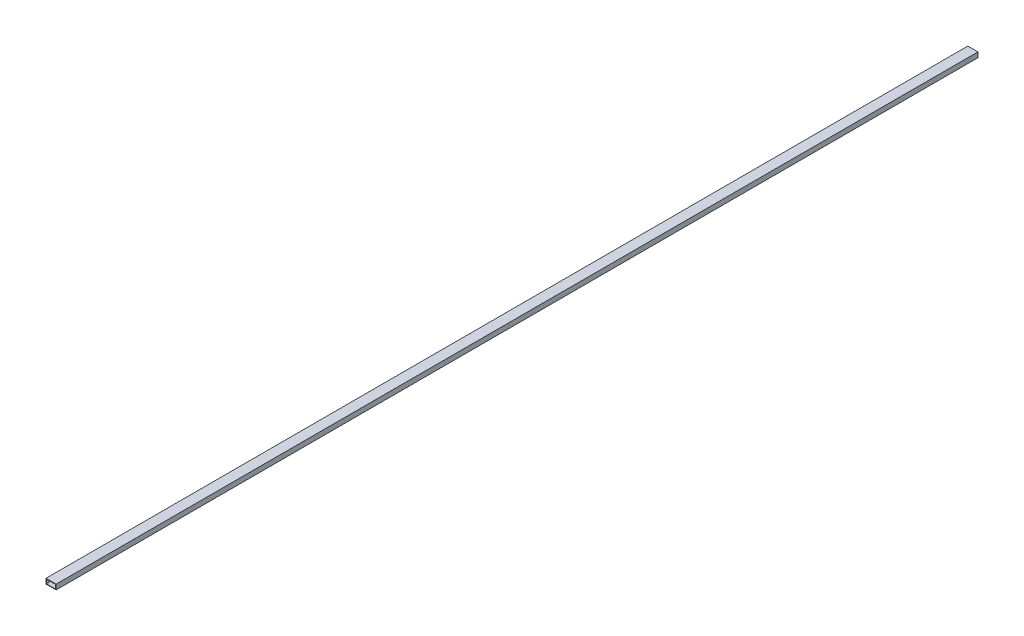
ISO-10303-21;
HEADER;
FILE_DESCRIPTION(('STEP AP214'),'2;1');
FILE_NAME('part.step','',(''),(''),'','','');
FILE_SCHEMA(('AUTOMOTIVE_DESIGN { 1 0 10303 214 1 1 1 1 }'));
ENDSEC;
DATA;
#1=APPLICATION_CONTEXT('core data for automotive mechanical design processes');
#2=APPLICATION_PROTOCOL_DEFINITION('international standard','automotive_design',2000,#1);
#3=PRODUCT_CONTEXT('',#1,'mechanical');
#4=PRODUCT('Part','Part','',(#3));
#5=PRODUCT_RELATED_PRODUCT_CATEGORY('part','',(#4));
#6=PRODUCT_DEFINITION_FORMATION('','',#4);
#7=PRODUCT_DEFINITION_CONTEXT('part definition',#1,'design');
#8=PRODUCT_DEFINITION('design','',#6,#7);
#9=PRODUCT_DEFINITION_SHAPE('','',#8);
#10=(LENGTH_UNIT() NAMED_UNIT(*) SI_UNIT(.MILLI.,.METRE.));
#11=(NAMED_UNIT(*) PLANE_ANGLE_UNIT() SI_UNIT($,.RADIAN.));
#12=(NAMED_UNIT(*) SI_UNIT($,.STERADIAN.) SOLID_ANGLE_UNIT());
#13=UNCERTAINTY_MEASURE_WITH_UNIT(LENGTH_MEASURE(1.E-05),#10,'distance_accuracy_value','');
#14=(GEOMETRIC_REPRESENTATION_CONTEXT(3) GLOBAL_UNCERTAINTY_ASSIGNED_CONTEXT((#13)) GLOBAL_UNIT_ASSIGNED_CONTEXT((#10,
#11,#12)) REPRESENTATION_CONTEXT('',''));
#15=CARTESIAN_POINT('',(0.,0.,0.));
#16=DIRECTION('',(0.,0.,1.));
#17=DIRECTION('',(1.,0.,0.));
#18=AXIS2_PLACEMENT_3D('',#15,#16,#17);
#19=CARTESIAN_POINT('',(0.,0.,1820.));
#20=DIRECTION('',(0.,0.,-1.));
#21=DIRECTION('',(-1.,0.,0.));
#22=AXIS2_PLACEMENT_3D('',#19,#20,#21);
#23=PLANE('',#22);
#24=DIRECTION('',(0.,-1.,0.));
#25=VECTOR('',#24,1.);
#26=CARTESIAN_POINT('',(0.,0.,1820.));
#27=LINE('',#26,#25);
#28=CARTESIAN_POINT('',(0.,10.,1820.));
#29=VERTEX_POINT('',#28);
#30=CARTESIAN_POINT('',(0.,0.,1820.));
#31=VERTEX_POINT('',#30);
#32=EDGE_CURVE('E136',#29,#31,#27,.T.);
#33=ORIENTED_EDGE('',*,*,#32,.T.);
#34=DIRECTION('',(1.,0.,0.));
#35=VECTOR('',#34,1.);
#36=CARTESIAN_POINT('',(0.,0.,1820.));
#37=LINE('',#36,#35);
#38=CARTESIAN_POINT('',(20.,0.,1820.));
#39=VERTEX_POINT('',#38);
#40=EDGE_CURVE('E139',#31,#39,#37,.T.);
#41=ORIENTED_EDGE('',*,*,#40,.T.);
#42=DIRECTION('',(0.,1.,0.));
#43=VECTOR('',#42,1.);
#44=CARTESIAN_POINT('',(20.,0.,1820.));
#45=LINE('',#44,#43);
#46=CARTESIAN_POINT('',(20.,10.,1820.));
#47=VERTEX_POINT('',#46);
#48=EDGE_CURVE('E142',#39,#47,#45,.T.);
#49=ORIENTED_EDGE('',*,*,#48,.T.);
#50=DIRECTION('',(-1.,0.,0.));
#51=VECTOR('',#50,1.);
#52=CARTESIAN_POINT('',(0.,10.,1820.));
#53=LINE('',#52,#51);
#54=EDGE_CURVE('E144',#47,#29,#53,.T.);
#55=ORIENTED_EDGE('',*,*,#54,.T.);
#56=EDGE_LOOP('',(#33,#41,#49,#55));
#57=FACE_BOUND('',#56,.T.);
#58=DIRECTION('',(0.,-1.,0.));
#59=VECTOR('',#58,1.);
#60=CARTESIAN_POINT('',(1.,1.,1820.));
#61=LINE('',#60,#59);
#62=CARTESIAN_POINT('',(1.,9.,1820.));
#63=VERTEX_POINT('',#62);
#64=CARTESIAN_POINT('',(1.,1.,1820.));
#65=VERTEX_POINT('',#64);
#66=EDGE_CURVE('E100',#63,#65,#61,.T.);
#67=ORIENTED_EDGE('',*,*,#66,.F.);
#68=DIRECTION('',(-1.,0.,0.));
#69=VECTOR('',#68,1.);
#70=CARTESIAN_POINT('',(1.,9.,1820.));
#71=LINE('',#70,#69);
#72=CARTESIAN_POINT('',(19.,9.,1820.));
#73=VERTEX_POINT('',#72);
#74=EDGE_CURVE('E122',#73,#63,#71,.T.);
#75=ORIENTED_EDGE('',*,*,#74,.F.);
#76=DIRECTION('',(0.,1.,0.));
#77=VECTOR('',#76,1.);
#78=CARTESIAN_POINT('',(19.,1.,1820.));
#79=LINE('',#78,#77);
#80=CARTESIAN_POINT('',(19.,1.,1820.));
#81=VERTEX_POINT('',#80);
#82=EDGE_CURVE('E120',#81,#73,#79,.T.);
#83=ORIENTED_EDGE('',*,*,#82,.F.);
#84=DIRECTION('',(1.,0.,0.));
#85=VECTOR('',#84,1.);
#86=CARTESIAN_POINT('',(1.,1.,1820.));
#87=LINE('',#86,#85);
#88=EDGE_CURVE('E108',#65,#81,#87,.T.);
#89=ORIENTED_EDGE('',*,*,#88,.F.);
#90=EDGE_LOOP('',(#67,#75,#83,#89));
#91=FACE_BOUND('',#90,.T.);
#92=ADVANCED_FACE('F35',(#57,#91),#23,.F.);
#93=CARTESIAN_POINT('',(0.,0.,0.));
#94=DIRECTION('',(0.,0.,-1.));
#95=DIRECTION('',(-1.,0.,0.));
#96=AXIS2_PLACEMENT_3D('',#93,#94,#95);
#97=PLANE('',#96);
#98=DIRECTION('',(0.,-1.,0.));
#99=VECTOR('',#98,1.);
#100=CARTESIAN_POINT('',(0.,0.,0.));
#101=LINE('',#100,#99);
#102=CARTESIAN_POINT('',(0.,10.,0.));
#103=VERTEX_POINT('',#102);
#104=CARTESIAN_POINT('',(0.,0.,0.));
#105=VERTEX_POINT('',#104);
#106=EDGE_CURVE('E116',#103,#105,#101,.T.);
#107=ORIENTED_EDGE('',*,*,#106,.F.);
#108=DIRECTION('',(-1.,0.,0.));
#109=VECTOR('',#108,1.);
#110=CARTESIAN_POINT('',(0.,10.,0.));
#111=LINE('',#110,#109);
#112=CARTESIAN_POINT('',(20.,10.,0.));
#113=VERTEX_POINT('',#112);
#114=EDGE_CURVE('E140',#113,#103,#111,.T.);
#115=ORIENTED_EDGE('',*,*,#114,.F.);
#116=DIRECTION('',(0.,1.,0.));
#117=VECTOR('',#116,1.);
#118=CARTESIAN_POINT('',(20.,0.,0.));
#119=LINE('',#118,#117);
#120=CARTESIAN_POINT('',(20.,0.,0.));
#121=VERTEX_POINT('',#120);
#122=EDGE_CURVE('E151',#121,#113,#119,.T.);
#123=ORIENTED_EDGE('',*,*,#122,.F.);
#124=DIRECTION('',(1.,0.,0.));
#125=VECTOR('',#124,1.);
#126=CARTESIAN_POINT('',(0.,0.,0.));
#127=LINE('',#126,#125);
#128=EDGE_CURVE('E149',#105,#121,#127,.T.);
#129=ORIENTED_EDGE('',*,*,#128,.F.);
#130=EDGE_LOOP('',(#107,#115,#123,#129));
#131=FACE_BOUND('',#130,.T.);
#132=DIRECTION('',(-1.,0.,0.));
#133=VECTOR('',#132,1.);
#134=CARTESIAN_POINT('',(1.,9.,0.));
#135=LINE('',#134,#133);
#136=CARTESIAN_POINT('',(19.,9.,0.));
#137=VERTEX_POINT('',#136);
#138=CARTESIAN_POINT('',(1.,9.,0.));
#139=VERTEX_POINT('',#138);
#140=EDGE_CURVE('E109',#137,#139,#135,.T.);
#141=ORIENTED_EDGE('',*,*,#140,.T.);
#142=DIRECTION('',(0.,-1.,0.));
#143=VECTOR('',#142,1.);
#144=CARTESIAN_POINT('',(1.,1.,0.));
#145=LINE('',#144,#143);
#146=CARTESIAN_POINT('',(1.,1.,0.));
#147=VERTEX_POINT('',#146);
#148=EDGE_CURVE('E58',#139,#147,#145,.T.);
#149=ORIENTED_EDGE('',*,*,#148,.T.);
#150=DIRECTION('',(1.,0.,0.));
#151=VECTOR('',#150,1.);
#152=CARTESIAN_POINT('',(1.,1.,0.));
#153=LINE('',#152,#151);
#154=CARTESIAN_POINT('',(19.,1.,0.));
#155=VERTEX_POINT('',#154);
#156=EDGE_CURVE('E115',#147,#155,#153,.T.);
#157=ORIENTED_EDGE('',*,*,#156,.T.);
#158=DIRECTION('',(0.,1.,0.));
#159=VECTOR('',#158,1.);
#160=CARTESIAN_POINT('',(19.,1.,0.));
#161=LINE('',#160,#159);
#162=EDGE_CURVE('E128',#155,#137,#161,.T.);
#163=ORIENTED_EDGE('',*,*,#162,.T.);
#164=EDGE_LOOP('',(#141,#149,#157,#163));
#165=FACE_BOUND('',#164,.T.);
#166=ADVANCED_FACE('F169',(#131,#165),#97,.T.);
#167=CARTESIAN_POINT('',(0.,0.,1820.));
#168=DIRECTION('',(1.,0.,0.));
#169=DIRECTION('',(0.,0.,-1.));
#170=AXIS2_PLACEMENT_3D('',#167,#168,#169);
#171=PLANE('',#170);
#172=ORIENTED_EDGE('',*,*,#106,.T.);
#173=DIRECTION('',(0.,0.,-1.));
#174=VECTOR('',#173,1.);
#175=CARTESIAN_POINT('',(0.,0.,1820.));
#176=LINE('',#175,#174);
#177=EDGE_CURVE('E11',#31,#105,#176,.T.);
#178=ORIENTED_EDGE('',*,*,#177,.F.);
#179=ORIENTED_EDGE('',*,*,#32,.F.);
#180=DIRECTION('',(0.,0.,-1.));
#181=VECTOR('',#180,1.);
#182=CARTESIAN_POINT('',(0.,10.,1820.));
#183=LINE('',#182,#181);
#184=EDGE_CURVE('E146',#29,#103,#183,.T.);
#185=ORIENTED_EDGE('',*,*,#184,.T.);
#186=EDGE_LOOP('',(#172,#178,#179,#185));
#187=FACE_BOUND('',#186,.T.);
#188=ADVANCED_FACE('F37',(#187),#171,.F.);
#189=CARTESIAN_POINT('',(0.,0.,1820.));
#190=DIRECTION('',(0.,1.,0.));
#191=DIRECTION('',(0.,0.,1.));
#192=AXIS2_PLACEMENT_3D('',#189,#190,#191);
#193=PLANE('',#192);
#194=ORIENTED_EDGE('',*,*,#128,.T.);
#195=DIRECTION('',(0.,0.,-1.));
#196=VECTOR('',#195,1.);
#197=CARTESIAN_POINT('',(20.,0.,1820.));
#198=LINE('',#197,#196);
#199=EDGE_CURVE('E43',#39,#121,#198,.T.);
#200=ORIENTED_EDGE('',*,*,#199,.F.);
#201=ORIENTED_EDGE('',*,*,#40,.F.);
#202=ORIENTED_EDGE('',*,*,#177,.T.);
#203=EDGE_LOOP('',(#194,#200,#201,#202));
#204=FACE_BOUND('',#203,.T.);
#205=ADVANCED_FACE('F179',(#204),#193,.F.);
#206=CARTESIAN_POINT('',(20.,0.,1820.));
#207=DIRECTION('',(-1.,0.,0.));
#208=DIRECTION('',(0.,0.,1.));
#209=AXIS2_PLACEMENT_3D('',#206,#207,#208);
#210=PLANE('',#209);
#211=ORIENTED_EDGE('',*,*,#122,.T.);
#212=DIRECTION('',(0.,0.,-1.));
#213=VECTOR('',#212,1.);
#214=CARTESIAN_POINT('',(20.,10.,1820.));
#215=LINE('',#214,#213);
#216=EDGE_CURVE('E156',#47,#113,#215,.T.);
#217=ORIENTED_EDGE('',*,*,#216,.F.);
#218=ORIENTED_EDGE('',*,*,#48,.F.);
#219=ORIENTED_EDGE('',*,*,#199,.T.);
#220=EDGE_LOOP('',(#211,#217,#218,#219));
#221=FACE_BOUND('',#220,.T.);
#222=ADVANCED_FACE('F163',(#221),#210,.F.);
#223=CARTESIAN_POINT('',(0.,10.,1820.));
#224=DIRECTION('',(0.,-1.,0.));
#225=DIRECTION('',(0.,0.,-1.));
#226=AXIS2_PLACEMENT_3D('',#223,#224,#225);
#227=PLANE('',#226);
#228=ORIENTED_EDGE('',*,*,#114,.T.);
#229=ORIENTED_EDGE('',*,*,#184,.F.);
#230=ORIENTED_EDGE('',*,*,#54,.F.);
#231=ORIENTED_EDGE('',*,*,#216,.T.);
#232=EDGE_LOOP('',(#228,#229,#230,#231));
#233=FACE_BOUND('',#232,.T.);
#234=ADVANCED_FACE('F173',(#233),#227,.F.);
#235=CARTESIAN_POINT('',(1.,1.,1820.));
#236=DIRECTION('',(1.,0.,0.));
#237=DIRECTION('',(0.,0.,-1.));
#238=AXIS2_PLACEMENT_3D('',#235,#236,#237);
#239=PLANE('',#238);
#240=ORIENTED_EDGE('',*,*,#148,.F.);
#241=DIRECTION('',(0.,0.,-1.));
#242=VECTOR('',#241,1.);
#243=CARTESIAN_POINT('',(1.,9.,1820.));
#244=LINE('',#243,#242);
#245=EDGE_CURVE('E104',#63,#139,#244,.T.);
#246=ORIENTED_EDGE('',*,*,#245,.F.);
#247=ORIENTED_EDGE('',*,*,#66,.T.);
#248=DIRECTION('',(0.,0.,-1.));
#249=VECTOR('',#248,1.);
#250=CARTESIAN_POINT('',(1.,1.,1820.));
#251=LINE('',#250,#249);
#252=EDGE_CURVE('E103',#65,#147,#251,.T.);
#253=ORIENTED_EDGE('',*,*,#252,.T.);
#254=EDGE_LOOP('',(#240,#246,#247,#253));
#255=FACE_BOUND('',#254,.T.);
#256=ADVANCED_FACE('F102',(#255),#239,.T.);
#257=CARTESIAN_POINT('',(1.,1.,1820.));
#258=DIRECTION('',(0.,1.,0.));
#259=DIRECTION('',(0.,0.,1.));
#260=AXIS2_PLACEMENT_3D('',#257,#258,#259);
#261=PLANE('',#260);
#262=ORIENTED_EDGE('',*,*,#156,.F.);
#263=ORIENTED_EDGE('',*,*,#252,.F.);
#264=ORIENTED_EDGE('',*,*,#88,.T.);
#265=DIRECTION('',(0.,0.,-1.));
#266=VECTOR('',#265,1.);
#267=CARTESIAN_POINT('',(19.,1.,1820.));
#268=LINE('',#267,#266);
#269=EDGE_CURVE('E117',#81,#155,#268,.T.);
#270=ORIENTED_EDGE('',*,*,#269,.T.);
#271=EDGE_LOOP('',(#262,#263,#264,#270));
#272=FACE_BOUND('',#271,.T.);
#273=ADVANCED_FACE('F112',(#272),#261,.T.);
#274=CARTESIAN_POINT('',(19.,1.,1820.));
#275=DIRECTION('',(-1.,0.,0.));
#276=DIRECTION('',(0.,0.,1.));
#277=AXIS2_PLACEMENT_3D('',#274,#275,#276);
#278=PLANE('',#277);
#279=ORIENTED_EDGE('',*,*,#162,.F.);
#280=ORIENTED_EDGE('',*,*,#269,.F.);
#281=ORIENTED_EDGE('',*,*,#82,.T.);
#282=DIRECTION('',(0.,0.,-1.));
#283=VECTOR('',#282,1.);
#284=CARTESIAN_POINT('',(19.,9.,1820.));
#285=LINE('',#284,#283);
#286=EDGE_CURVE('E50',#73,#137,#285,.T.);
#287=ORIENTED_EDGE('',*,*,#286,.T.);
#288=EDGE_LOOP('',(#279,#280,#281,#287));
#289=FACE_BOUND('',#288,.T.);
#290=ADVANCED_FACE('F202',(#289),#278,.T.);
#291=CARTESIAN_POINT('',(1.,9.,1820.));
#292=DIRECTION('',(0.,-1.,0.));
#293=DIRECTION('',(0.,0.,-1.));
#294=AXIS2_PLACEMENT_3D('',#291,#292,#293);
#295=PLANE('',#294);
#296=ORIENTED_EDGE('',*,*,#140,.F.);
#297=ORIENTED_EDGE('',*,*,#286,.F.);
#298=ORIENTED_EDGE('',*,*,#74,.T.);
#299=ORIENTED_EDGE('',*,*,#245,.T.);
#300=EDGE_LOOP('',(#296,#297,#298,#299));
#301=FACE_BOUND('',#300,.T.);
#302=ADVANCED_FACE('F206',(#301),#295,.T.);
#303=CLOSED_SHELL('',(#92,#166,#188,#205,#222,#234,#256,#273,#290,#302));
#304=MANIFOLD_SOLID_BREP('B2',#303);
#305=ADVANCED_BREP_SHAPE_REPRESENTATION('',(#18,#304),#14);
#306=SHAPE_DEFINITION_REPRESENTATION(#9,#305);
ENDSEC;
END-ISO-10303-21;
